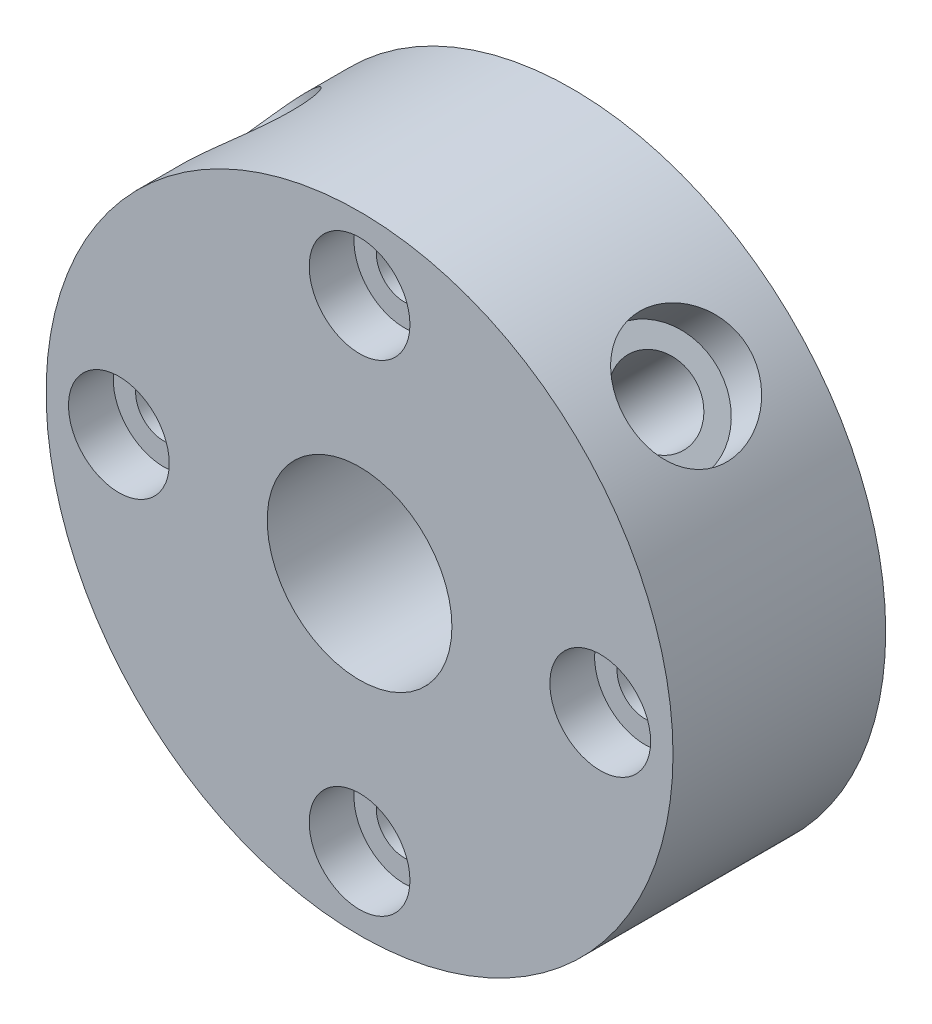
ISO-10303-21;
HEADER;
FILE_DESCRIPTION(('STEP AP214'),'2;1');
FILE_NAME('part.step','',(''),(''),'','','');
FILE_SCHEMA(('AUTOMOTIVE_DESIGN { 1 0 10303 214 1 1 1 1 }'));
ENDSEC;
DATA;
#1=APPLICATION_CONTEXT('core data for automotive mechanical design processes');
#2=APPLICATION_PROTOCOL_DEFINITION('international standard','automotive_design',2000,#1);
#3=PRODUCT_CONTEXT('',#1,'mechanical');
#4=PRODUCT('Part','Part','',(#3));
#5=PRODUCT_RELATED_PRODUCT_CATEGORY('part','',(#4));
#6=PRODUCT_DEFINITION_FORMATION('','',#4);
#7=PRODUCT_DEFINITION_CONTEXT('part definition',#1,'design');
#8=PRODUCT_DEFINITION('design','',#6,#7);
#9=PRODUCT_DEFINITION_SHAPE('','',#8);
#10=(LENGTH_UNIT() NAMED_UNIT(*) SI_UNIT(.MILLI.,.METRE.));
#11=(NAMED_UNIT(*) PLANE_ANGLE_UNIT() SI_UNIT($,.RADIAN.));
#12=(NAMED_UNIT(*) SI_UNIT($,.STERADIAN.) SOLID_ANGLE_UNIT());
#13=UNCERTAINTY_MEASURE_WITH_UNIT(LENGTH_MEASURE(1.E-05),#10,'distance_accuracy_value','');
#14=(GEOMETRIC_REPRESENTATION_CONTEXT(3) GLOBAL_UNCERTAINTY_ASSIGNED_CONTEXT((#13)) GLOBAL_UNIT_ASSIGNED_CONTEXT((#10,
#11,#12)) REPRESENTATION_CONTEXT('',''));
#15=CARTESIAN_POINT('',(0.,0.,0.));
#16=DIRECTION('',(0.,0.,1.));
#17=DIRECTION('',(1.,0.,0.));
#18=AXIS2_PLACEMENT_3D('',#15,#16,#17);
#19=CARTESIAN_POINT('',(2.12132034355965,-2.12132034355964,4.75));
#20=DIRECTION('',(-0.707106781186549,0.707106781186546,0.));
#21=DIRECTION('',(-0.707106781186546,-0.707106781186549,0.));
#22=AXIS2_PLACEMENT_3D('',#19,#20,#21);
#23=CYLINDRICAL_SURFACE('',#22,1.75);
#24=CARTESIAN_POINT('',(-3.87875519321589,1.40388145906296,4.75));
#25=CARTESIAN_POINT('',(-3.87875504872702,1.40389679740029,4.65683462411124));
#26=CARTESIAN_POINT('',(-3.87596179582414,1.41167623165675,4.56352440180328));
#27=CARTESIAN_POINT('',(-3.86467796407788,1.44226770697339,4.37960740507038));
#28=CARTESIAN_POINT('',(-3.85617217734836,1.46511987168365,4.28900852303185));
#29=CARTESIAN_POINT('',(-3.83321846153762,1.52415624225882,4.11351168243882));
#30=CARTESIAN_POINT('',(-3.81879533954179,1.56028472499894,4.02859162481189));
#31=CARTESIAN_POINT('',(-3.78359810064227,1.64379298880312,3.86597716137847));
#32=CARTESIAN_POINT('',(-3.76282532380555,1.69117039536029,3.78828123545845));
#33=CARTESIAN_POINT('',(-3.71300562380287,1.79802178820207,3.63725886737519));
#34=CARTESIAN_POINT('',(-3.68354538724624,1.85804169682687,3.56445477716569));
#35=CARTESIAN_POINT('',(-3.61636150678791,1.98563614295418,3.43010307318747));
#36=CARTESIAN_POINT('',(-3.57863462076731,2.05321363938136,3.36855989329138));
#37=CARTESIAN_POINT('',(-3.49261655032857,2.19648276506879,3.25577794831698));
#38=CARTESIAN_POINT('',(-3.44392453372875,2.27240320250071,3.20513157328556));
#39=CARTESIAN_POINT('',(-3.33714345450023,2.42649208880238,3.11960805287753));
#40=CARTESIAN_POINT('',(-3.2790587252318,2.50465948742002,3.08472366367955));
#41=CARTESIAN_POINT('',(-3.15770502236321,2.6558250919398,3.03362200270482));
#42=CARTESIAN_POINT('',(-3.09488209168043,2.72887543038908,3.01650270572978));
#43=CARTESIAN_POINT('',(-2.96314384804859,2.87137650376676,2.99849779815717));
#44=CARTESIAN_POINT('',(-2.8942311147703,2.94082874327815,2.99760534659683));
#45=CARTESIAN_POINT('',(-2.75704156560581,3.06963318358901,3.01161707315852));
#46=CARTESIAN_POINT('',(-2.68899859995951,3.12934609747977,3.0255288295855));
#47=CARTESIAN_POINT('',(-2.55171784105952,3.24226211286154,3.06704664396782));
#48=CARTESIAN_POINT('',(-2.48247995994158,3.29546473329203,3.09465371314038));
#49=CARTESIAN_POINT('',(-2.34403548506183,3.39536858978804,3.16309992813553));
#50=CARTESIAN_POINT('',(-2.27484556648633,3.4419579436046,3.20413499646392));
#51=CARTESIAN_POINT('',(-2.13986778973416,3.52746140018656,3.29807604104704));
#52=CARTESIAN_POINT('',(-2.07408115751437,3.56637275113578,3.35098625891696));
#53=CARTESIAN_POINT('',(-1.94353900932661,3.63926780944078,3.47164447097263));
#54=CARTESIAN_POINT('',(-1.8792061184678,3.67268765776492,3.54019149971046));
#55=CARTESIAN_POINT('',(-1.75966291195632,3.73144174354957,3.68793544630793));
#56=CARTESIAN_POINT('',(-1.70445638098777,3.75677263056993,3.76713675790751));
#57=CARTESIAN_POINT('',(-1.6041524191666,3.80071451501754,3.93744471039027));
#58=CARTESIAN_POINT('',(-1.55947820988091,3.81905820723174,4.02887182257843));
#59=CARTESIAN_POINT('',(-1.48578902282584,3.84833036274252,4.21893122891693));
#60=CARTESIAN_POINT('',(-1.45676237184095,3.85926435530996,4.31755808945045));
#61=CARTESIAN_POINT('',(-1.41800916493867,3.87366458989071,4.51221821762711));
#62=CARTESIAN_POINT('',(-1.40712688812988,3.87757932894082,4.60798737853588));
#63=CARTESIAN_POINT('',(-1.40189153189013,3.87947652441924,4.80001922446157));
#64=CARTESIAN_POINT('',(-1.40753237532972,3.87746116191105,4.89628171503356));
#65=CARTESIAN_POINT('',(-1.43393125947882,3.86776882129364,5.0797203713787));
#66=CARTESIAN_POINT('',(-1.4536441097922,3.86048284037411,5.16707149464675));
#67=CARTESIAN_POINT('',(-1.50571910017159,3.84046965898871,5.3372519131145));
#68=CARTESIAN_POINT('',(-1.53808426980661,3.82774115525466,5.4200801198945));
#69=CARTESIAN_POINT('',(-1.6153061610817,3.79581649336568,5.58285607332163));
#70=CARTESIAN_POINT('',(-1.66064099667774,3.776365306974,5.6625259646047));
#71=CARTESIAN_POINT('',(-1.76091101964833,3.73066351917329,5.81343952711155));
#72=CARTESIAN_POINT('',(-1.81585046628037,3.70440989865848,5.88467943637635));
#73=CARTESIAN_POINT('',(-1.93809565714854,3.64204627931806,6.0230155641412));
#74=CARTESIAN_POINT('',(-2.0060555626498,3.60528823582755,6.08924505671109));
#75=CARTESIAN_POINT('',(-2.14781782978841,3.52267331279601,6.20850400627098));
#76=CARTESIAN_POINT('',(-2.22162071645001,3.47681561504164,6.26153227527956));
#77=CARTESIAN_POINT('',(-2.3724429448231,3.37570794353618,6.35289858037206));
#78=CARTESIAN_POINT('',(-2.44947402830687,3.32042093909688,6.3911766799386));
#79=CARTESIAN_POINT('',(-2.6033082774888,3.20122693568277,6.45116037498667));
#80=CARTESIAN_POINT('',(-2.68011155492852,3.13732530519757,6.47287623610936));
#81=CARTESIAN_POINT('',(-2.82497343926154,3.00731387533357,6.49779200143486));
#82=CARTESIAN_POINT('',(-2.89326350026185,2.94169439906989,6.50221257243772));
#83=CARTESIAN_POINT('',(-3.0247776419073,2.80628690238728,6.49572107858363));
#84=CARTESIAN_POINT('',(-3.08800266705183,2.73649966340565,6.48481187940356));
#85=CARTESIAN_POINT('',(-3.20546510895128,2.59780202985199,6.44884685108928));
#86=CARTESIAN_POINT('',(-3.25995182505672,2.52895810736167,6.42434101843772));
#87=CARTESIAN_POINT('',(-3.3618585762086,2.39182709550411,6.36248977108512));
#88=CARTESIAN_POINT('',(-3.40927729259944,2.32354011228416,6.32514196478273));
#89=CARTESIAN_POINT('',(-3.49872283612633,2.18667582389566,6.23677445924827));
#90=CARTESIAN_POINT('',(-3.54040621700387,2.11822664767966,6.18521006459595));
#91=CARTESIAN_POINT('',(-3.61584225868931,1.98672253134804,6.07065392087558));
#92=CARTESIAN_POINT('',(-3.6495918376877,1.92366969341634,6.00765774802337));
#93=CARTESIAN_POINT('',(-3.71170213019758,1.8010952065894,5.86676244737382));
#94=CARTESIAN_POINT('',(-3.73951051806183,1.74214161209223,5.78812301670563));
#95=CARTESIAN_POINT('',(-3.78716235341497,1.63597850132651,5.62100112870199));
#96=CARTESIAN_POINT('',(-3.80700124127507,1.58877571396041,5.53251307348987));
#97=CARTESIAN_POINT('',(-3.83926364131782,1.50914831731297,5.348174375474));
#98=CARTESIAN_POINT('',(-3.85171050876722,1.47667724043257,5.25234801333486));
#99=CARTESIAN_POINT('',(-3.86971447524827,1.4288512859078,5.05608939168261));
#100=CARTESIAN_POINT('',(-3.87529468873944,1.41343900284144,4.95567377111812));
#101=CARTESIAN_POINT('',(-3.87836191080345,1.40496346798567,4.8199078677301));
#102=CARTESIAN_POINT('',(-3.87875524744128,1.40387570272184,4.78496413419555));
#103=CARTESIAN_POINT('',(-3.87875519321589,1.40388145906296,4.75));
#104=B_SPLINE_CURVE_WITH_KNOTS('',3,(#24,#25,#26,#27,#28,#29,#30,#31,#32,#33,#34,#35,#36,#37,
#38,#39,#40,#41,#42,#43,#44,#45,#46,#47,#48,#49,#50,#51,#52,#53,#54,#55,#56,#57,#58,#59,#60,#61,
#62,#63,#64,#65,#66,#67,#68,#69,#70,#71,#72,#73,#74,#75,#76,#77,#78,#79,#80,#81,#82,#83,#84,#85,
#86,#87,#88,#89,#90,#91,#92,#93,#94,#95,#96,#97,#98,#99,#100,#101,#102,#103),.UNSPECIFIED.,.T.,
.F.,(4,2,2,2,2,2,2,2,2,2,2,2,2,2,2,2,2,2,2,2,2,2,2,2,2,2,2,2,2,2,2,2,2,2,2,2,2,2,2,4),(0.,
0.279393045522117,0.559532854151841,0.838510049788066,1.11742840910632,1.41268093983001,
1.70804947433979,2.01678532860467,2.32537915077832,2.61739741514974,2.90929256671864,
3.18278387864067,3.45629538727546,3.73399017073292,4.01178430066578,4.30977305525939,
4.60788507689962,4.91646886951211,5.22482213621397,5.512657373983,5.80038676053791,
6.0687111120657,6.33709975264009,6.61705179220311,6.89712829558488,7.20100792212447,
7.50491488499066,7.81004405289107,8.11498394094752,8.39796631566544,8.68089579799355,
8.95313685094106,9.22542863168535,9.5101081932848,9.79489815388857,10.0998965797762,
10.4050692582123,10.7092725345641,11.0124489787529,11.1173026955307),.UNSPECIFIED.);
#105=CARTESIAN_POINT('',(-3.87875519321589,1.40388145906296,4.75));
#106=VERTEX_POINT('',#105);
#107=EDGE_CURVE('E116',#106,#106,#104,.T.);
#108=ORIENTED_EDGE('',*,*,#107,.T.);
#109=EDGE_LOOP('',(#108));
#110=FACE_BOUND('',#109,.T.);
#111=CARTESIAN_POINT('',(-8.48528137423859,8.48528137423855,4.75));
#112=DIRECTION('',(-0.707106781186549,0.707106781186546,0.));
#113=DIRECTION('',(-0.707106781186546,-0.707106781186549,0.));
#114=AXIS2_PLACEMENT_3D('',#111,#112,#113);
#115=CIRCLE('',#114,1.75);
#116=CARTESIAN_POINT('',(-9.72271824131504,7.24784450716209,4.75));
#117=VERTEX_POINT('',#116);
#118=EDGE_CURVE('E67',#117,#117,#115,.F.);
#119=ORIENTED_EDGE('',*,*,#118,.F.);
#120=EDGE_LOOP('',(#119));
#121=FACE_BOUND('',#120,.T.);
#122=ADVANCED_FACE('F37',(#110,#121),#23,.F.);
#123=CARTESIAN_POINT('',(-2.12132034355964,-2.12132034355965,4.75));
#124=DIRECTION('',(0.707106781186546,0.707106781186549,0.));
#125=DIRECTION('',(-0.707106781186549,0.707106781186546,0.));
#126=AXIS2_PLACEMENT_3D('',#123,#124,#125);
#127=CYLINDRICAL_SURFACE('',#126,1.75);
#128=CARTESIAN_POINT('',(1.40388145906297,3.87875519321589,4.75));
#129=CARTESIAN_POINT('',(1.40389679740029,3.87875504872702,4.65683462411124));
#130=CARTESIAN_POINT('',(1.41167623165676,3.87596179582414,4.56352440180328));
#131=CARTESIAN_POINT('',(1.44226770697339,3.86467796407788,4.37960740507038));
#132=CARTESIAN_POINT('',(1.46511987168365,3.85617217734836,4.28900852303185));
#133=CARTESIAN_POINT('',(1.52415624225882,3.83321846153762,4.11351168243883));
#134=CARTESIAN_POINT('',(1.56028472499894,3.81879533954179,4.0285916248119));
#135=CARTESIAN_POINT('',(1.64379298880312,3.78359810064227,3.86597716137847));
#136=CARTESIAN_POINT('',(1.69117039536029,3.76282532380555,3.78828123545845));
#137=CARTESIAN_POINT('',(1.79802178820207,3.71300562380287,3.63725886737519));
#138=CARTESIAN_POINT('',(1.85804169682687,3.68354538724624,3.56445477716569));
#139=CARTESIAN_POINT('',(1.98563614295418,3.61636150678791,3.43010307318747));
#140=CARTESIAN_POINT('',(2.05321363938136,3.57863462076731,3.36855989329138));
#141=CARTESIAN_POINT('',(2.19648276506879,3.49261655032857,3.25577794831698));
#142=CARTESIAN_POINT('',(2.27240320250071,3.44392453372875,3.20513157328556));
#143=CARTESIAN_POINT('',(2.42649208880238,3.33714345450023,3.11960805287753));
#144=CARTESIAN_POINT('',(2.50465948742001,3.2790587252318,3.08472366367955));
#145=CARTESIAN_POINT('',(2.6558250919398,3.15770502236321,3.03362200270482));
#146=CARTESIAN_POINT('',(2.72887543038907,3.09488209168043,3.01650270572978));
#147=CARTESIAN_POINT('',(2.87137650376676,2.96314384804859,2.99849779815717));
#148=CARTESIAN_POINT('',(2.94082874327815,2.89423111477031,2.99760534659683));
#149=CARTESIAN_POINT('',(3.06963318358901,2.75704156560581,3.01161707315852));
#150=CARTESIAN_POINT('',(3.12934609747977,2.68899859995951,3.0255288295855));
#151=CARTESIAN_POINT('',(3.24226211286153,2.55171784105952,3.06704664396782));
#152=CARTESIAN_POINT('',(3.29546473329203,2.48247995994158,3.09465371314038));
#153=CARTESIAN_POINT('',(3.39536858978804,2.34403548506183,3.16309992813553));
#154=CARTESIAN_POINT('',(3.4419579436046,2.27484556648633,3.20413499646392));
#155=CARTESIAN_POINT('',(3.52746140018656,2.13986778973416,3.29807604104704));
#156=CARTESIAN_POINT('',(3.56637275113578,2.07408115751437,3.35098625891696));
#157=CARTESIAN_POINT('',(3.63926780944078,1.94353900932661,3.47164447097262));
#158=CARTESIAN_POINT('',(3.67268765776492,1.8792061184678,3.54019149971046));
#159=CARTESIAN_POINT('',(3.73144174354957,1.75966291195632,3.68793544630793));
#160=CARTESIAN_POINT('',(3.75677263056993,1.70445638098778,3.76713675790751));
#161=CARTESIAN_POINT('',(3.80071451501754,1.6041524191666,3.93744471039027));
#162=CARTESIAN_POINT('',(3.81905820723174,1.55947820988091,4.02887182257843));
#163=CARTESIAN_POINT('',(3.84833036274252,1.48578902282584,4.21893122891693));
#164=CARTESIAN_POINT('',(3.85926435530996,1.45676237184095,4.31755808945045));
#165=CARTESIAN_POINT('',(3.87366458989071,1.41800916493868,4.51221821762711));
#166=CARTESIAN_POINT('',(3.87757932894082,1.40712688812988,4.60798737853588));
#167=CARTESIAN_POINT('',(3.87947652441924,1.40189153189012,4.80001922446157));
#168=CARTESIAN_POINT('',(3.87746116191105,1.40753237532972,4.89628171503356));
#169=CARTESIAN_POINT('',(3.86776882129364,1.43393125947882,5.0797203713787));
#170=CARTESIAN_POINT('',(3.86048284037411,1.4536441097922,5.16707149464675));
#171=CARTESIAN_POINT('',(3.84046965898871,1.50571910017159,5.3372519131145));
#172=CARTESIAN_POINT('',(3.82774115525466,1.5380842698066,5.42008011989449));
#173=CARTESIAN_POINT('',(3.79581649336568,1.6153061610817,5.58285607332163));
#174=CARTESIAN_POINT('',(3.776365306974,1.66064099667774,5.6625259646047));
#175=CARTESIAN_POINT('',(3.73066351917329,1.76091101964833,5.81343952711154));
#176=CARTESIAN_POINT('',(3.70440989865848,1.81585046628037,5.88467943637635));
#177=CARTESIAN_POINT('',(3.64204627931806,1.93809565714854,6.0230155641412));
#178=CARTESIAN_POINT('',(3.60528823582755,2.00605556264979,6.08924505671109));
#179=CARTESIAN_POINT('',(3.52267331279601,2.14781782978841,6.20850400627097));
#180=CARTESIAN_POINT('',(3.47681561504165,2.22162071645001,6.26153227527956));
#181=CARTESIAN_POINT('',(3.37570794353618,2.3724429448231,6.35289858037206));
#182=CARTESIAN_POINT('',(3.32042093909688,2.44947402830687,6.3911766799386));
#183=CARTESIAN_POINT('',(3.20122693568277,2.6033082774888,6.45116037498667));
#184=CARTESIAN_POINT('',(3.13732530519757,2.68011155492852,6.47287623610936));
#185=CARTESIAN_POINT('',(3.00731387533357,2.82497343926154,6.49779200143486));
#186=CARTESIAN_POINT('',(2.94169439906989,2.89326350026185,6.50221257243772));
#187=CARTESIAN_POINT('',(2.80628690238728,3.0247776419073,6.49572107858363));
#188=CARTESIAN_POINT('',(2.73649966340565,3.08800266705183,6.48481187940356));
#189=CARTESIAN_POINT('',(2.59780202985199,3.20546510895128,6.44884685108928));
#190=CARTESIAN_POINT('',(2.52895810736167,3.25995182505672,6.42434101843772));
#191=CARTESIAN_POINT('',(2.39182709550411,3.3618585762086,6.36248977108512));
#192=CARTESIAN_POINT('',(2.32354011228416,3.40927729259944,6.32514196478273));
#193=CARTESIAN_POINT('',(2.18667582389566,3.49872283612633,6.23677445924827));
#194=CARTESIAN_POINT('',(2.11822664767966,3.54040621700387,6.18521006459595));
#195=CARTESIAN_POINT('',(1.98672253134804,3.61584225868931,6.07065392087558));
#196=CARTESIAN_POINT('',(1.92366969341634,3.64959183768769,6.00765774802337));
#197=CARTESIAN_POINT('',(1.8010952065894,3.71170213019758,5.86676244737382));
#198=CARTESIAN_POINT('',(1.74214161209223,3.73951051806183,5.78812301670563));
#199=CARTESIAN_POINT('',(1.63597850132652,3.78716235341497,5.62100112870199));
#200=CARTESIAN_POINT('',(1.58877571396041,3.80700124127507,5.53251307348987));
#201=CARTESIAN_POINT('',(1.50914831731297,3.83926364131782,5.348174375474));
#202=CARTESIAN_POINT('',(1.47667724043257,3.85171050876722,5.25234801333486));
#203=CARTESIAN_POINT('',(1.4288512859078,3.86971447524826,5.05608939168261));
#204=CARTESIAN_POINT('',(1.41343900284144,3.87529468873944,4.95567377111812));
#205=CARTESIAN_POINT('',(1.40496346798567,3.87836191080345,4.8199078677301));
#206=CARTESIAN_POINT('',(1.40387570272184,3.87875524744128,4.78496413419555));
#207=CARTESIAN_POINT('',(1.40388145906297,3.87875519321589,4.75));
#208=B_SPLINE_CURVE_WITH_KNOTS('',3,(#128,#129,#130,#131,#132,#133,#134,#135,#136,#137,#138,
#139,#140,#141,#142,#143,#144,#145,#146,#147,#148,#149,#150,#151,#152,#153,#154,#155,#156,#157,
#158,#159,#160,#161,#162,#163,#164,#165,#166,#167,#168,#169,#170,#171,#172,#173,#174,#175,#176,
#177,#178,#179,#180,#181,#182,#183,#184,#185,#186,#187,#188,#189,#190,#191,#192,#193,#194,#195,
#196,#197,#198,#199,#200,#201,#202,#203,#204,#205,#206,#207),.UNSPECIFIED.,.T.,.F.,(4,2,2,2,2,2,
2,2,2,2,2,2,2,2,2,2,2,2,2,2,2,2,2,2,2,2,2,2,2,2,2,2,2,2,2,2,2,2,2,4),(0.,0.279393045522116,
0.559532854151839,0.838510049788063,1.11742840910631,1.41268093983001,1.70804947433979,
2.01678532860466,2.32537915077832,2.61739741514974,2.90929256671864,3.18278387864067,
3.45629538727546,3.73399017073292,4.01178430066578,4.30977305525938,4.60788507689962,
4.91646886951211,5.22482213621396,5.512657373983,5.80038676053791,6.06871111206569,
6.33709975264009,6.61705179220311,6.89712829558488,7.20100792212446,7.50491488499066,
7.81004405289107,8.11498394094752,8.39796631566544,8.68089579799354,8.95313685094106,
9.22542863168535,9.5101081932848,9.79489815388856,10.0998965797762,10.4050692582123,
10.7092725345641,11.0124489787529,11.1173026955307),.UNSPECIFIED.);
#209=CARTESIAN_POINT('',(1.40388145906297,3.87875519321589,4.75));
#210=VERTEX_POINT('',#209);
#211=EDGE_CURVE('E124',#210,#210,#208,.T.);
#212=ORIENTED_EDGE('',*,*,#211,.T.);
#213=EDGE_LOOP('',(#212));
#214=FACE_BOUND('',#213,.T.);
#215=CARTESIAN_POINT('',(8.48528137423855,8.48528137423859,4.75));
#216=DIRECTION('',(0.707106781186546,0.707106781186549,0.));
#217=DIRECTION('',(-0.707106781186549,0.707106781186546,0.));
#218=AXIS2_PLACEMENT_3D('',#215,#216,#217);
#219=CIRCLE('',#218,1.75);
#220=CARTESIAN_POINT('',(7.24784450716209,9.72271824131504,4.75));
#221=VERTEX_POINT('',#220);
#222=EDGE_CURVE('E65',#221,#221,#219,.F.);
#223=ORIENTED_EDGE('',*,*,#222,.F.);
#224=EDGE_LOOP('',(#223));
#225=FACE_BOUND('',#224,.T.);
#226=ADVANCED_FACE('F111',(#214,#225),#127,.F.);
#227=CARTESIAN_POINT('',(-10.75,0.,0.));
#228=DIRECTION('',(0.,0.,1.));
#229=DIRECTION('',(1.,0.,0.));
#230=AXIS2_PLACEMENT_3D('',#227,#228,#229);
#231=CYLINDRICAL_SURFACE('',#230,1.25);
#232=CARTESIAN_POINT('',(-10.75,0.,0.));
#233=DIRECTION('',(0.,0.,1.));
#234=DIRECTION('',(1.,0.,0.));
#235=AXIS2_PLACEMENT_3D('',#232,#233,#234);
#236=CIRCLE('',#235,1.25);
#237=CARTESIAN_POINT('',(-9.5,0.,0.));
#238=VERTEX_POINT('',#237);
#239=EDGE_CURVE('E166',#238,#238,#236,.T.);
#240=ORIENTED_EDGE('',*,*,#239,.F.);
#241=EDGE_LOOP('',(#240));
#242=FACE_BOUND('',#241,.T.);
#243=CARTESIAN_POINT('',(-10.75,0.,7.5));
#244=DIRECTION('',(0.,0.,1.));
#245=DIRECTION('',(1.,0.,0.));
#246=AXIS2_PLACEMENT_3D('',#243,#244,#245);
#247=CIRCLE('',#246,1.25);
#248=CARTESIAN_POINT('',(-9.5,0.,7.5));
#249=VERTEX_POINT('',#248);
#250=EDGE_CURVE('E125',#249,#249,#247,.F.);
#251=ORIENTED_EDGE('',*,*,#250,.F.);
#252=EDGE_LOOP('',(#251));
#253=FACE_BOUND('',#252,.T.);
#254=ADVANCED_FACE('F253',(#242,#253),#231,.F.);
#255=CARTESIAN_POINT('',(0.,-10.75,0.));
#256=DIRECTION('',(0.,0.,1.));
#257=DIRECTION('',(1.,0.,0.));
#258=AXIS2_PLACEMENT_3D('',#255,#256,#257);
#259=CYLINDRICAL_SURFACE('',#258,1.25);
#260=CARTESIAN_POINT('',(0.,-10.75,0.));
#261=DIRECTION('',(0.,0.,1.));
#262=DIRECTION('',(1.,0.,0.));
#263=AXIS2_PLACEMENT_3D('',#260,#261,#262);
#264=CIRCLE('',#263,1.25);
#265=CARTESIAN_POINT('',(1.25,-10.75,0.));
#266=VERTEX_POINT('',#265);
#267=EDGE_CURVE('E162',#266,#266,#264,.T.);
#268=ORIENTED_EDGE('',*,*,#267,.F.);
#269=EDGE_LOOP('',(#268));
#270=FACE_BOUND('',#269,.T.);
#271=CARTESIAN_POINT('',(0.,-10.75,7.5));
#272=DIRECTION('',(0.,0.,1.));
#273=DIRECTION('',(1.,0.,0.));
#274=AXIS2_PLACEMENT_3D('',#271,#272,#273);
#275=CIRCLE('',#274,1.25);
#276=CARTESIAN_POINT('',(1.25,-10.75,7.5));
#277=VERTEX_POINT('',#276);
#278=EDGE_CURVE('E468',#277,#277,#275,.F.);
#279=ORIENTED_EDGE('',*,*,#278,.F.);
#280=EDGE_LOOP('',(#279));
#281=FACE_BOUND('',#280,.T.);
#282=ADVANCED_FACE('F258',(#270,#281),#259,.F.);
#283=CARTESIAN_POINT('',(10.75,0.,0.));
#284=DIRECTION('',(0.,0.,1.));
#285=DIRECTION('',(1.,0.,0.));
#286=AXIS2_PLACEMENT_3D('',#283,#284,#285);
#287=CYLINDRICAL_SURFACE('',#286,1.25);
#288=CARTESIAN_POINT('',(10.75,0.,0.));
#289=DIRECTION('',(0.,0.,1.));
#290=DIRECTION('',(1.,0.,0.));
#291=AXIS2_PLACEMENT_3D('',#288,#289,#290);
#292=CIRCLE('',#291,1.25);
#293=CARTESIAN_POINT('',(12.,0.,0.));
#294=VERTEX_POINT('',#293);
#295=EDGE_CURVE('E158',#294,#294,#292,.T.);
#296=ORIENTED_EDGE('',*,*,#295,.F.);
#297=EDGE_LOOP('',(#296));
#298=FACE_BOUND('',#297,.T.);
#299=CARTESIAN_POINT('',(10.75,0.,7.5));
#300=DIRECTION('',(0.,0.,1.));
#301=DIRECTION('',(1.,0.,0.));
#302=AXIS2_PLACEMENT_3D('',#299,#300,#301);
#303=CIRCLE('',#302,1.25);
#304=CARTESIAN_POINT('',(12.,0.,7.5));
#305=VERTEX_POINT('',#304);
#306=EDGE_CURVE('E466',#305,#305,#303,.F.);
#307=ORIENTED_EDGE('',*,*,#306,.F.);
#308=EDGE_LOOP('',(#307));
#309=FACE_BOUND('',#308,.T.);
#310=ADVANCED_FACE('F270',(#298,#309),#287,.F.);
#311=CARTESIAN_POINT('',(0.,10.75,0.));
#312=DIRECTION('',(0.,0.,1.));
#313=DIRECTION('',(1.,0.,0.));
#314=AXIS2_PLACEMENT_3D('',#311,#312,#313);
#315=CYLINDRICAL_SURFACE('',#314,1.25);
#316=CARTESIAN_POINT('',(0.,10.75,0.));
#317=DIRECTION('',(0.,0.,1.));
#318=DIRECTION('',(1.,0.,0.));
#319=AXIS2_PLACEMENT_3D('',#316,#317,#318);
#320=CIRCLE('',#319,1.25);
#321=CARTESIAN_POINT('',(1.25,10.75,0.));
#322=VERTEX_POINT('',#321);
#323=EDGE_CURVE('E154',#322,#322,#320,.T.);
#324=ORIENTED_EDGE('',*,*,#323,.F.);
#325=EDGE_LOOP('',(#324));
#326=FACE_BOUND('',#325,.T.);
#327=CARTESIAN_POINT('',(0.,10.75,7.5));
#328=DIRECTION('',(0.,0.,1.));
#329=DIRECTION('',(1.,0.,0.));
#330=AXIS2_PLACEMENT_3D('',#327,#328,#329);
#331=CIRCLE('',#330,1.25);
#332=CARTESIAN_POINT('',(1.25,10.75,7.5));
#333=VERTEX_POINT('',#332);
#334=EDGE_CURVE('E130',#333,#333,#331,.F.);
#335=ORIENTED_EDGE('',*,*,#334,.F.);
#336=EDGE_LOOP('',(#335));
#337=FACE_BOUND('',#336,.T.);
#338=ADVANCED_FACE('F150',(#326,#337),#315,.F.);
#339=CARTESIAN_POINT('',(0.,0.,2.));
#340=DIRECTION('',(0.,0.,-1.));
#341=DIRECTION('',(-1.,0.,0.));
#342=AXIS2_PLACEMENT_3D('',#339,#340,#341);
#343=CYLINDRICAL_SURFACE('',#342,14.);
#344=CARTESIAN_POINT('',(-11.6511779774216,7.76209068089556,4.75));
#345=CARTESIAN_POINT('',(-11.6511760710743,7.76209685743818,4.59713864487768));
#346=CARTESIAN_POINT('',(-11.6439600918152,7.77295873329219,4.44420467965564));
#347=CARTESIAN_POINT('',(-11.6151562478213,7.81593176789737,4.14265905280335));
#348=CARTESIAN_POINT('',(-11.5935566814567,7.84806022774672,3.99405101331165));
#349=CARTESIAN_POINT('',(-11.5362296800744,7.9320849840361,3.70556360702522));
#350=CARTESIAN_POINT('',(-11.5005160354634,7.9839619830083,3.5656758739027));
#351=CARTESIAN_POINT('',(-11.4153350658881,8.10528188694974,3.29828223466166));
#352=CARTESIAN_POINT('',(-11.3658685973735,8.17472369805544,3.1707755581864));
#353=CARTESIAN_POINT('',(-11.2530317647504,8.32937722105698,2.9300161059738));
#354=CARTESIAN_POINT('',(-11.1894986642951,8.4147715125977,2.81695685091667));
#355=CARTESIAN_POINT('',(-11.0496963781696,8.59752415467707,2.60999006066215));
#356=CARTESIAN_POINT('',(-10.9734263172008,8.69488332733456,2.51608384266932));
#357=CARTESIAN_POINT('',(-10.8086291445262,8.89892412332568,2.34934056719733));
#358=CARTESIAN_POINT('',(-10.7200045154781,9.00567714337162,2.27668699234182));
#359=CARTESIAN_POINT('',(-10.5327025177477,9.22403606803345,2.15569481193111));
#360=CARTESIAN_POINT('',(-10.4340260574771,9.33564153359888,2.10735401150367));
#361=CARTESIAN_POINT('',(-10.2302260166266,9.55850280250496,2.03696085636299));
#362=CARTESIAN_POINT('',(-10.125200430248,9.66974499008799,2.01458187495326));
#363=CARTESIAN_POINT('',(-9.91038456070153,9.88978808390079,1.99572894559391));
#364=CARTESIAN_POINT('',(-9.80059472202804,9.99858921644498,1.99925258612951));
#365=CARTESIAN_POINT('',(-9.58102744775139,10.2091500460516,2.0318563354567));
#366=CARTESIAN_POINT('',(-9.4712705661895,10.3109859487607,2.06058465450608));
#367=CARTESIAN_POINT('',(-9.25368197503286,10.5067024995948,2.14222474936271));
#368=CARTESIAN_POINT('',(-9.14585034068459,10.6005828373187,2.19513746825414));
#369=CARTESIAN_POINT('',(-8.93496579021392,10.7789421572765,2.32397297266082));
#370=CARTESIAN_POINT('',(-8.83194610420595,10.8633601811193,2.40003439842101));
#371=CARTESIAN_POINT('',(-8.6348846554936,11.0206482091051,2.57290575092377));
#372=CARTESIAN_POINT('',(-8.54084389264235,11.0935169277635,2.66971798449848));
#373=CARTESIAN_POINT('',(-8.36359389448011,11.2277730733744,2.88327523820785));
#374=CARTESIAN_POINT('',(-8.28059342328153,11.2889467968924,3.00032810568758));
#375=CARTESIAN_POINT('',(-8.13053710814367,11.3974983784731,3.25002375031689));
#376=CARTESIAN_POINT('',(-8.06348154485832,11.4448759937072,3.38266680181535));
#377=CARTESIAN_POINT('',(-7.9479795776025,11.5253898480945,3.66019695454488));
#378=CARTESIAN_POINT('',(-7.89957076518362,11.5584973347093,3.80510807845731));
#379=CARTESIAN_POINT('',(-7.82372493303534,11.6099720242653,4.10281950411176));
#380=CARTESIAN_POINT('',(-7.79628528514657,11.6283410744552,4.25561881462842));
#381=CARTESIAN_POINT('',(-7.76393296601738,11.6499665945253,4.56206569919598));
#382=CARTESIAN_POINT('',(-7.75865572008286,11.6534676558465,4.71565758188245));
#383=CARTESIAN_POINT('',(-7.76987377383254,11.6459909608475,5.02168243713359));
#384=CARTESIAN_POINT('',(-7.78636788530818,11.6350139946901,5.17411547248767));
#385=CARTESIAN_POINT('',(-7.84010957468696,11.5988664947171,5.47205705658004));
#386=CARTESIAN_POINT('',(-7.87716491147389,11.5738274114488,5.61761639167118));
#387=CARTESIAN_POINT('',(-7.97027158902165,11.5099061771373,5.89931251813332));
#388=CARTESIAN_POINT('',(-8.02632444711121,11.4710229203497,6.03544855582098));
#389=CARTESIAN_POINT('',(-8.15593958330598,11.3792359676262,6.29632225600289));
#390=CARTESIAN_POINT('',(-8.229713598075,11.3261617735527,6.42089467042176));
#391=CARTESIAN_POINT('',(-8.39149189120414,11.2068257799823,6.65337678166906));
#392=CARTESIAN_POINT('',(-8.47949757981278,11.1405626734163,6.76128482511373));
#393=CARTESIAN_POINT('',(-8.66788418245452,10.9946423388,6.95900125477127));
#394=CARTESIAN_POINT('',(-8.76842864337674,10.9148017777596,7.04851884805999));
#395=CARTESIAN_POINT('',(-8.97720229742934,10.7437434762889,7.20485372190564));
#396=CARTESIAN_POINT('',(-9.085431175118,10.6525262027513,7.27167193361096));
#397=CARTESIAN_POINT('',(-9.30519361072117,10.4610931191872,7.38028411926557));
#398=CARTESIAN_POINT('',(-9.41670517858037,10.3609307606668,7.42221661584114));
#399=CARTESIAN_POINT('',(-9.63990993584737,10.1535865474959,7.48030692396769));
#400=CARTESIAN_POINT('',(-9.75160310268626,10.0464055084653,7.49646772485652));
#401=CARTESIAN_POINT('',(-9.96983508695565,9.82983362934317,7.50244353036993));
#402=CARTESIAN_POINT('',(-10.0764289582517,9.72051010286402,7.49269630858576));
#403=CARTESIAN_POINT('',(-10.2834877072507,9.50119100225686,7.44809707740773));
#404=CARTESIAN_POINT('',(-10.3839526564767,9.39119543598788,7.41324536103783));
#405=CARTESIAN_POINT('',(-10.5761187560898,9.17424036262302,7.31961812143022));
#406=CARTESIAN_POINT('',(-10.6678380278224,9.06727491541163,7.26089345488584));
#407=CARTESIAN_POINT('',(-10.8409023167005,8.85963471236125,7.12124177050664));
#408=CARTESIAN_POINT('',(-10.9222465491039,8.75896043266396,7.04031307467129));
#409=CARTESIAN_POINT('',(-11.0743849957406,8.56582542357789,6.85706506634693));
#410=CARTESIAN_POINT('',(-11.1449947627056,8.47351738730983,6.75443165263271));
#411=CARTESIAN_POINT('',(-11.2731371218947,8.30227954812329,6.53133486969797));
#412=CARTESIAN_POINT('',(-11.3306666202923,8.2233529113769,6.41086729333251));
#413=CARTESIAN_POINT('',(-11.4324685887437,8.08123775287278,6.15403136397606));
#414=CARTESIAN_POINT('',(-11.476598111931,8.0182200631203,6.01751173827291));
#415=CARTESIAN_POINT('',(-11.550271244279,7.91172932739614,5.73345773398099));
#416=CARTESIAN_POINT('',(-11.5798282437361,7.86823834216193,5.58593361120005));
#417=CARTESIAN_POINT('',(-11.6183350585297,7.81121771647316,5.32337110652133));
#418=CARTESIAN_POINT('',(-11.6306426848372,7.79284092765964,5.20984220063522));
#419=CARTESIAN_POINT('',(-11.6470647322009,7.76827527357894,4.98088929870786));
#420=CARTESIAN_POINT('',(-11.6511794174002,7.7620860153819,4.86546536388394));
#421=CARTESIAN_POINT('',(-11.6511779774216,7.76209068089556,4.75));
#422=B_SPLINE_CURVE_WITH_KNOTS('',3,(#344,#345,#346,#347,#348,#349,#350,#351,#352,#353,#354,
#355,#356,#357,#358,#359,#360,#361,#362,#363,#364,#365,#366,#367,#368,#369,#370,#371,#372,#373,
#374,#375,#376,#377,#378,#379,#380,#381,#382,#383,#384,#385,#386,#387,#388,#389,#390,#391,#392,
#393,#394,#395,#396,#397,#398,#399,#400,#401,#402,#403,#404,#405,#406,#407,#408,#409,#410,#411,
#412,#413,#414,#415,#416,#417,#418,#419,#420,#421),.UNSPECIFIED.,.T.,.F.,(4,2,2,2,2,2,2,2,2,2,2,
2,2,2,2,2,2,2,2,2,2,2,2,2,2,2,2,2,2,2,2,2,2,2,2,2,2,2,4),(0.,0.458161359266159,
0.916695907427622,1.37478353967289,1.83284265114413,2.29650709300992,2.76020341155038,
3.22779223307661,3.69533883473926,4.15693714034927,4.61849247204569,5.07370641763774,
5.52893811606669,5.98695177036365,6.44501636769502,6.91078471215003,7.37656125420932,
7.84327194031395,8.30992412187866,8.76886898779822,9.22778880706281,9.68248845652962,
10.1372244313406,10.5976905575203,11.0582023403144,11.5255141630079,11.9928068138484,
12.4574733411489,12.9220859664357,13.3788980434201,13.8357047885022,14.291543452743,
14.7474165750679,15.2104037928827,15.6735004056529,16.141376409648,16.6088216900946,
16.9549096446048,17.3009864409468),.UNSPECIFIED.);
#423=CARTESIAN_POINT('',(-11.6511779774216,7.76209068089556,4.75));
#424=VERTEX_POINT('',#423);
#425=EDGE_CURVE('E10',#424,#424,#422,.T.);
#426=ORIENTED_EDGE('',*,*,#425,.T.);
#427=EDGE_LOOP('',(#426));
#428=FACE_BOUND('',#427,.T.);
#429=CARTESIAN_POINT('',(7.76209068089556,11.6511779774216,4.75));
#430=CARTESIAN_POINT('',(7.76209685743817,11.6511760710743,4.59713864487768));
#431=CARTESIAN_POINT('',(7.77295873329218,11.6439600918152,4.44420467965564));
#432=CARTESIAN_POINT('',(7.81593176789736,11.6151562478213,4.14265905280335));
#433=CARTESIAN_POINT('',(7.84806022774672,11.5935566814567,3.99405101331165));
#434=CARTESIAN_POINT('',(7.9320849840361,11.5362296800744,3.70556360702522));
#435=CARTESIAN_POINT('',(7.9839619830083,11.5005160354634,3.5656758739027));
#436=CARTESIAN_POINT('',(8.10528188694973,11.4153350658881,3.29828223466166));
#437=CARTESIAN_POINT('',(8.17472369805544,11.3658685973735,3.1707755581864));
#438=CARTESIAN_POINT('',(8.32937722105697,11.2530317647504,2.9300161059738));
#439=CARTESIAN_POINT('',(8.41477151259769,11.1894986642951,2.81695685091667));
#440=CARTESIAN_POINT('',(8.59752415467706,11.0496963781696,2.60999006066215));
#441=CARTESIAN_POINT('',(8.69488332733455,10.9734263172008,2.51608384266932));
#442=CARTESIAN_POINT('',(8.89892412332567,10.8086291445262,2.34934056719733));
#443=CARTESIAN_POINT('',(9.00567714337162,10.7200045154781,2.27668699234182));
#444=CARTESIAN_POINT('',(9.22403606803344,10.5327025177477,2.15569481193111));
#445=CARTESIAN_POINT('',(9.33564153359888,10.4340260574771,2.10735401150367));
#446=CARTESIAN_POINT('',(9.55850280250495,10.2302260166266,2.03696085636299));
#447=CARTESIAN_POINT('',(9.66974499008799,10.125200430248,2.01458187495326));
#448=CARTESIAN_POINT('',(9.88978808390079,9.91038456070153,1.99572894559391));
#449=CARTESIAN_POINT('',(9.99858921644497,9.80059472202805,1.99925258612951));
#450=CARTESIAN_POINT('',(10.2091500460516,9.58102744775139,2.0318563354567));
#451=CARTESIAN_POINT('',(10.3109859487607,9.47127056618951,2.06058465450608));
#452=CARTESIAN_POINT('',(10.5067024995948,9.25368197503287,2.14222474936271));
#453=CARTESIAN_POINT('',(10.6005828373187,9.14585034068459,2.19513746825414));
#454=CARTESIAN_POINT('',(10.7789421572765,8.93496579021392,2.32397297266082));
#455=CARTESIAN_POINT('',(10.8633601811193,8.83194610420596,2.40003439842101));
#456=CARTESIAN_POINT('',(11.0206482091051,8.6348846554936,2.57290575092377));
#457=CARTESIAN_POINT('',(11.0935169277635,8.54084389264235,2.66971798449848));
#458=CARTESIAN_POINT('',(11.2277730733744,8.36359389448011,2.88327523820785));
#459=CARTESIAN_POINT('',(11.2889467968924,8.28059342328154,3.00032810568758));
#460=CARTESIAN_POINT('',(11.3974983784731,8.13053710814367,3.25002375031689));
#461=CARTESIAN_POINT('',(11.4448759937072,8.06348154485833,3.38266680181535));
#462=CARTESIAN_POINT('',(11.5253898480945,7.9479795776025,3.66019695454488));
#463=CARTESIAN_POINT('',(11.5584973347093,7.89957076518363,3.80510807845731));
#464=CARTESIAN_POINT('',(11.6099720242653,7.82372493303534,4.10281950411176));
#465=CARTESIAN_POINT('',(11.6283410744552,7.79628528514657,4.25561881462842));
#466=CARTESIAN_POINT('',(11.6499665945253,7.76393296601739,4.56206569919598));
#467=CARTESIAN_POINT('',(11.6534676558465,7.75865572008286,4.71565758188245));
#468=CARTESIAN_POINT('',(11.6459909608475,7.76987377383254,5.02168243713358));
#469=CARTESIAN_POINT('',(11.6350139946901,7.78636788530818,5.17411547248767));
#470=CARTESIAN_POINT('',(11.5988664947171,7.84010957468696,5.47205705658004));
#471=CARTESIAN_POINT('',(11.5738274114488,7.87716491147389,5.61761639167118));
#472=CARTESIAN_POINT('',(11.5099061771373,7.97027158902165,5.89931251813332));
#473=CARTESIAN_POINT('',(11.4710229203497,8.02632444711121,6.03544855582098));
#474=CARTESIAN_POINT('',(11.3792359676262,8.15593958330598,6.29632225600289));
#475=CARTESIAN_POINT('',(11.3261617735526,8.229713598075,6.42089467042176));
#476=CARTESIAN_POINT('',(11.2068257799823,8.39149189120414,6.65337678166906));
#477=CARTESIAN_POINT('',(11.1405626734163,8.47949757981278,6.76128482511373));
#478=CARTESIAN_POINT('',(10.9946423388,8.66788418245452,6.95900125477127));
#479=CARTESIAN_POINT('',(10.9148017777596,8.76842864337674,7.04851884805999));
#480=CARTESIAN_POINT('',(10.7437434762889,8.97720229742934,7.20485372190564));
#481=CARTESIAN_POINT('',(10.6525262027513,9.085431175118,7.27167193361096));
#482=CARTESIAN_POINT('',(10.4610931191872,9.30519361072118,7.38028411926557));
#483=CARTESIAN_POINT('',(10.3609307606668,9.41670517858037,7.42221661584114));
#484=CARTESIAN_POINT('',(10.1535865474959,9.63990993584737,7.48030692396769));
#485=CARTESIAN_POINT('',(10.0464055084653,9.75160310268626,7.49646772485652));
#486=CARTESIAN_POINT('',(9.82983362934317,9.96983508695565,7.50244353036993));
#487=CARTESIAN_POINT('',(9.72051010286401,10.0764289582517,7.49269630858576));
#488=CARTESIAN_POINT('',(9.50119100225685,10.2834877072507,7.44809707740773));
#489=CARTESIAN_POINT('',(9.39119543598788,10.3839526564767,7.41324536103783));
#490=CARTESIAN_POINT('',(9.17424036262301,10.5761187560898,7.31961812143023));
#491=CARTESIAN_POINT('',(9.06727491541162,10.6678380278224,7.26089345488584));
#492=CARTESIAN_POINT('',(8.85963471236125,10.8409023167005,7.12124177050664));
#493=CARTESIAN_POINT('',(8.75896043266396,10.9222465491039,7.04031307467129));
#494=CARTESIAN_POINT('',(8.56582542357789,11.0743849957406,6.85706506634693));
#495=CARTESIAN_POINT('',(8.47351738730982,11.1449947627056,6.75443165263271));
#496=CARTESIAN_POINT('',(8.30227954812328,11.2731371218947,6.53133486969797));
#497=CARTESIAN_POINT('',(8.2233529113769,11.3306666202923,6.41086729333251));
#498=CARTESIAN_POINT('',(8.08123775287278,11.4324685887437,6.15403136397606));
#499=CARTESIAN_POINT('',(8.01822006312029,11.476598111931,6.01751173827291));
#500=CARTESIAN_POINT('',(7.91172932739613,11.550271244279,5.73345773398099));
#501=CARTESIAN_POINT('',(7.86823834216192,11.5798282437361,5.58593361120005));
#502=CARTESIAN_POINT('',(7.81121771647315,11.6183350585297,5.32337110652133));
#503=CARTESIAN_POINT('',(7.79284092765964,11.6306426848372,5.20984220063522));
#504=CARTESIAN_POINT('',(7.76827527357894,11.6470647322009,4.98088929870786));
#505=CARTESIAN_POINT('',(7.76208601538189,11.6511794174002,4.86546536388394));
#506=CARTESIAN_POINT('',(7.76209068089556,11.6511779774216,4.75));
#507=B_SPLINE_CURVE_WITH_KNOTS('',3,(#429,#430,#431,#432,#433,#434,#435,#436,#437,#438,#439,
#440,#441,#442,#443,#444,#445,#446,#447,#448,#449,#450,#451,#452,#453,#454,#455,#456,#457,#458,
#459,#460,#461,#462,#463,#464,#465,#466,#467,#468,#469,#470,#471,#472,#473,#474,#475,#476,#477,
#478,#479,#480,#481,#482,#483,#484,#485,#486,#487,#488,#489,#490,#491,#492,#493,#494,#495,#496,
#497,#498,#499,#500,#501,#502,#503,#504,#505,#506),.UNSPECIFIED.,.T.,.F.,(4,2,2,2,2,2,2,2,2,2,2,
2,2,2,2,2,2,2,2,2,2,2,2,2,2,2,2,2,2,2,2,2,2,2,2,2,2,2,4),(0.,0.458161359266159,
0.916695907427622,1.37478353967289,1.83284265114413,2.29650709300992,2.76020341155038,
3.22779223307661,3.69533883473926,4.15693714034927,4.61849247204569,5.07370641763774,
5.52893811606669,5.98695177036365,6.44501636769502,6.91078471215002,7.37656125420932,
7.84327194031394,8.30992412187866,8.76886898779822,9.22778880706281,9.68248845652962,
10.1372244313406,10.5976905575203,11.0582023403144,11.5255141630079,11.9928068138484,
12.4574733411489,12.9220859664357,13.3788980434201,13.8357047885022,14.291543452743,
14.7474165750679,15.2104037928827,15.6735004056529,16.141376409648,16.6088216900946,
16.9549096446048,17.3009864409468),.UNSPECIFIED.);
#508=CARTESIAN_POINT('',(7.76209068089556,11.6511779774216,4.75));
#509=VERTEX_POINT('',#508);
#510=EDGE_CURVE('E49',#509,#509,#507,.T.);
#511=ORIENTED_EDGE('',*,*,#510,.T.);
#512=EDGE_LOOP('',(#511));
#513=FACE_BOUND('',#512,.T.);
#514=CARTESIAN_POINT('',(0.,0.,0.));
#515=DIRECTION('',(0.,0.,1.));
#516=DIRECTION('',(1.,0.,0.));
#517=AXIS2_PLACEMENT_3D('',#514,#515,#516);
#518=CIRCLE('',#517,14.);
#519=CARTESIAN_POINT('',(14.,0.,0.));
#520=VERTEX_POINT('',#519);
#521=EDGE_CURVE('E53',#520,#520,#518,.T.);
#522=ORIENTED_EDGE('',*,*,#521,.T.);
#523=EDGE_LOOP('',(#522));
#524=FACE_BOUND('',#523,.T.);
#525=CARTESIAN_POINT('',(0.,0.,9.5));
#526=DIRECTION('',(0.,0.,1.));
#527=DIRECTION('',(1.,0.,0.));
#528=AXIS2_PLACEMENT_3D('',#525,#526,#527);
#529=CIRCLE('',#528,14.);
#530=CARTESIAN_POINT('',(14.,0.,9.5));
#531=VERTEX_POINT('',#530);
#532=EDGE_CURVE('E58',#531,#531,#529,.T.);
#533=ORIENTED_EDGE('',*,*,#532,.F.);
#534=EDGE_LOOP('',(#533));
#535=FACE_BOUND('',#534,.T.);
#536=ADVANCED_FACE('F39',(#428,#513,#524,#535),#343,.T.);
#537=CARTESIAN_POINT('',(0.,0.,0.));
#538=DIRECTION('',(0.,0.,1.));
#539=DIRECTION('',(1.,0.,0.));
#540=AXIS2_PLACEMENT_3D('',#537,#538,#539);
#541=PLANE('',#540);
#542=ORIENTED_EDGE('',*,*,#323,.T.);
#543=EDGE_LOOP('',(#542));
#544=FACE_BOUND('',#543,.T.);
#545=ORIENTED_EDGE('',*,*,#295,.T.);
#546=EDGE_LOOP('',(#545));
#547=FACE_BOUND('',#546,.T.);
#548=ORIENTED_EDGE('',*,*,#267,.T.);
#549=EDGE_LOOP('',(#548));
#550=FACE_BOUND('',#549,.T.);
#551=ORIENTED_EDGE('',*,*,#239,.T.);
#552=EDGE_LOOP('',(#551));
#553=FACE_BOUND('',#552,.T.);
#554=CARTESIAN_POINT('',(0.,0.,0.));
#555=DIRECTION('',(0.,0.,-1.));
#556=DIRECTION('',(-1.,0.,0.));
#557=AXIS2_PLACEMENT_3D('',#554,#555,#556);
#558=CIRCLE('',#557,5.);
#559=CARTESIAN_POINT('',(-5.,0.,0.));
#560=VERTEX_POINT('',#559);
#561=EDGE_CURVE('E170',#560,#560,#558,.T.);
#562=ORIENTED_EDGE('',*,*,#561,.F.);
#563=EDGE_LOOP('',(#562));
#564=FACE_BOUND('',#563,.T.);
#565=ORIENTED_EDGE('',*,*,#521,.F.);
#566=EDGE_LOOP('',(#565));
#567=FACE_BOUND('',#566,.T.);
#568=ADVANCED_FACE('F143',(#544,#547,#550,#553,#564,#567),#541,.F.);
#569=CARTESIAN_POINT('',(0.,0.,9.5));
#570=DIRECTION('',(0.,0.,1.));
#571=DIRECTION('',(1.,0.,0.));
#572=AXIS2_PLACEMENT_3D('',#569,#570,#571);
#573=PLANE('',#572);
#574=CARTESIAN_POINT('',(0.,10.75,9.5));
#575=DIRECTION('',(0.,0.,1.));
#576=DIRECTION('',(1.,0.,0.));
#577=AXIS2_PLACEMENT_3D('',#574,#575,#576);
#578=CIRCLE('',#577,2.25);
#579=CARTESIAN_POINT('',(2.25,10.75,9.5));
#580=VERTEX_POINT('',#579);
#581=EDGE_CURVE('E214',#580,#580,#578,.T.);
#582=ORIENTED_EDGE('',*,*,#581,.F.);
#583=EDGE_LOOP('',(#582));
#584=FACE_BOUND('',#583,.T.);
#585=CARTESIAN_POINT('',(10.75,0.,9.5));
#586=DIRECTION('',(0.,0.,1.));
#587=DIRECTION('',(1.,0.,0.));
#588=AXIS2_PLACEMENT_3D('',#585,#586,#587);
#589=CIRCLE('',#588,2.25);
#590=CARTESIAN_POINT('',(13.,0.,9.5));
#591=VERTEX_POINT('',#590);
#592=EDGE_CURVE('E211',#591,#591,#589,.T.);
#593=ORIENTED_EDGE('',*,*,#592,.F.);
#594=EDGE_LOOP('',(#593));
#595=FACE_BOUND('',#594,.T.);
#596=CARTESIAN_POINT('',(0.,-10.75,9.5));
#597=DIRECTION('',(0.,0.,1.));
#598=DIRECTION('',(1.,0.,0.));
#599=AXIS2_PLACEMENT_3D('',#596,#597,#598);
#600=CIRCLE('',#599,2.25);
#601=CARTESIAN_POINT('',(2.25,-10.75,9.5));
#602=VERTEX_POINT('',#601);
#603=EDGE_CURVE('E205',#602,#602,#600,.T.);
#604=ORIENTED_EDGE('',*,*,#603,.F.);
#605=EDGE_LOOP('',(#604));
#606=FACE_BOUND('',#605,.T.);
#607=CARTESIAN_POINT('',(-10.75,0.,9.5));
#608=DIRECTION('',(0.,0.,1.));
#609=DIRECTION('',(1.,0.,0.));
#610=AXIS2_PLACEMENT_3D('',#607,#608,#609);
#611=CIRCLE('',#610,2.25);
#612=CARTESIAN_POINT('',(-8.5,0.,9.5));
#613=VERTEX_POINT('',#612);
#614=EDGE_CURVE('E199',#613,#613,#611,.T.);
#615=ORIENTED_EDGE('',*,*,#614,.F.);
#616=EDGE_LOOP('',(#615));
#617=FACE_BOUND('',#616,.T.);
#618=ORIENTED_EDGE('',*,*,#532,.T.);
#619=EDGE_LOOP('',(#618));
#620=FACE_BOUND('',#619,.T.);
#621=CARTESIAN_POINT('',(0.,0.,9.5));
#622=DIRECTION('',(0.,0.,1.));
#623=DIRECTION('',(1.,0.,0.));
#624=AXIS2_PLACEMENT_3D('',#621,#622,#623);
#625=CIRCLE('',#624,4.125);
#626=CARTESIAN_POINT('',(4.125,0.,9.5));
#627=VERTEX_POINT('',#626);
#628=EDGE_CURVE('E177',#627,#627,#625,.T.);
#629=ORIENTED_EDGE('',*,*,#628,.F.);
#630=EDGE_LOOP('',(#629));
#631=FACE_BOUND('',#630,.T.);
#632=ADVANCED_FACE('F138',(#584,#595,#606,#617,#620,#631),#573,.T.);
#633=CARTESIAN_POINT('',(0.,0.,9.5));
#634=DIRECTION('',(0.,0.,-1.));
#635=DIRECTION('',(-1.,0.,0.));
#636=AXIS2_PLACEMENT_3D('',#633,#634,#635);
#637=CYLINDRICAL_SURFACE('',#636,4.125);
#638=ORIENTED_EDGE('',*,*,#107,.F.);
#639=EDGE_LOOP('',(#638));
#640=FACE_BOUND('',#639,.T.);
#641=ORIENTED_EDGE('',*,*,#211,.F.);
#642=EDGE_LOOP('',(#641));
#643=FACE_BOUND('',#642,.T.);
#644=ORIENTED_EDGE('',*,*,#628,.T.);
#645=EDGE_LOOP('',(#644));
#646=FACE_BOUND('',#645,.T.);
#647=CARTESIAN_POINT('',(0.,0.,2.));
#648=DIRECTION('',(0.,0.,1.));
#649=DIRECTION('',(1.,0.,0.));
#650=AXIS2_PLACEMENT_3D('',#647,#648,#649);
#651=CIRCLE('',#650,4.125);
#652=CARTESIAN_POINT('',(4.125,0.,2.));
#653=VERTEX_POINT('',#652);
#654=EDGE_CURVE('E180',#653,#653,#651,.F.);
#655=ORIENTED_EDGE('',*,*,#654,.T.);
#656=EDGE_LOOP('',(#655));
#657=FACE_BOUND('',#656,.T.);
#658=ADVANCED_FACE('F132',(#640,#643,#646,#657),#637,.F.);
#659=CARTESIAN_POINT('',(0.,0.,2.));
#660=DIRECTION('',(0.,0.,-1.));
#661=DIRECTION('',(-1.,0.,0.));
#662=AXIS2_PLACEMENT_3D('',#659,#660,#661);
#663=CYLINDRICAL_SURFACE('',#662,5.);
#664=CARTESIAN_POINT('',(0.,0.,2.));
#665=DIRECTION('',(0.,0.,-1.));
#666=DIRECTION('',(-1.,0.,0.));
#667=AXIS2_PLACEMENT_3D('',#664,#665,#666);
#668=CIRCLE('',#667,5.);
#669=CARTESIAN_POINT('',(-5.,0.,2.));
#670=VERTEX_POINT('',#669);
#671=EDGE_CURVE('E184',#670,#670,#668,.T.);
#672=ORIENTED_EDGE('',*,*,#671,.F.);
#673=EDGE_LOOP('',(#672));
#674=FACE_BOUND('',#673,.T.);
#675=ORIENTED_EDGE('',*,*,#561,.T.);
#676=EDGE_LOOP('',(#675));
#677=FACE_BOUND('',#676,.T.);
#678=ADVANCED_FACE('F137',(#674,#677),#663,.F.);
#679=CARTESIAN_POINT('',(0.,0.,2.));
#680=DIRECTION('',(0.,0.,-1.));
#681=DIRECTION('',(-1.,0.,0.));
#682=AXIS2_PLACEMENT_3D('',#679,#680,#681);
#683=PLANE('',#682);
#684=ORIENTED_EDGE('',*,*,#654,.F.);
#685=EDGE_LOOP('',(#684));
#686=FACE_BOUND('',#685,.T.);
#687=ORIENTED_EDGE('',*,*,#671,.T.);
#688=EDGE_LOOP('',(#687));
#689=FACE_BOUND('',#688,.T.);
#690=ADVANCED_FACE('F80',(#686,#689),#683,.T.);
#691=CARTESIAN_POINT('',(0.,10.75,7.5));
#692=DIRECTION('',(0.,0.,1.));
#693=DIRECTION('',(1.,0.,0.));
#694=AXIS2_PLACEMENT_3D('',#691,#692,#693);
#695=PLANE('',#694);
#696=CARTESIAN_POINT('',(0.,10.75,7.5));
#697=DIRECTION('',(0.,0.,1.));
#698=DIRECTION('',(1.,0.,0.));
#699=AXIS2_PLACEMENT_3D('',#696,#697,#698);
#700=CIRCLE('',#699,2.25);
#701=CARTESIAN_POINT('',(2.25,10.75,7.5));
#702=VERTEX_POINT('',#701);
#703=EDGE_CURVE('E217',#702,#702,#700,.T.);
#704=ORIENTED_EDGE('',*,*,#703,.T.);
#705=EDGE_LOOP('',(#704));
#706=FACE_BOUND('',#705,.T.);
#707=ORIENTED_EDGE('',*,*,#334,.T.);
#708=EDGE_LOOP('',(#707));
#709=FACE_BOUND('',#708,.T.);
#710=ADVANCED_FACE('F76',(#706,#709),#695,.T.);
#711=CARTESIAN_POINT('',(0.,10.75,7.5));
#712=DIRECTION('',(0.,0.,1.));
#713=DIRECTION('',(1.,0.,0.));
#714=AXIS2_PLACEMENT_3D('',#711,#712,#713);
#715=CYLINDRICAL_SURFACE('',#714,2.25);
#716=ORIENTED_EDGE('',*,*,#703,.F.);
#717=EDGE_LOOP('',(#716));
#718=FACE_BOUND('',#717,.T.);
#719=ORIENTED_EDGE('',*,*,#581,.T.);
#720=EDGE_LOOP('',(#719));
#721=FACE_BOUND('',#720,.T.);
#722=ADVANCED_FACE('F79',(#718,#721),#715,.F.);
#723=CARTESIAN_POINT('',(10.75,0.,7.5));
#724=DIRECTION('',(0.,0.,1.));
#725=DIRECTION('',(1.,0.,0.));
#726=AXIS2_PLACEMENT_3D('',#723,#724,#725);
#727=PLANE('',#726);
#728=CARTESIAN_POINT('',(10.75,0.,7.5));
#729=DIRECTION('',(0.,0.,1.));
#730=DIRECTION('',(1.,0.,0.));
#731=AXIS2_PLACEMENT_3D('',#728,#729,#730);
#732=CIRCLE('',#731,2.25);
#733=CARTESIAN_POINT('',(13.,0.,7.5));
#734=VERTEX_POINT('',#733);
#735=EDGE_CURVE('E208',#734,#734,#732,.T.);
#736=ORIENTED_EDGE('',*,*,#735,.T.);
#737=EDGE_LOOP('',(#736));
#738=FACE_BOUND('',#737,.T.);
#739=ORIENTED_EDGE('',*,*,#306,.T.);
#740=EDGE_LOOP('',(#739));
#741=FACE_BOUND('',#740,.T.);
#742=ADVANCED_FACE('F84',(#738,#741),#727,.T.);
#743=CARTESIAN_POINT('',(10.75,0.,7.5));
#744=DIRECTION('',(0.,0.,1.));
#745=DIRECTION('',(1.,0.,0.));
#746=AXIS2_PLACEMENT_3D('',#743,#744,#745);
#747=CYLINDRICAL_SURFACE('',#746,2.25);
#748=ORIENTED_EDGE('',*,*,#735,.F.);
#749=EDGE_LOOP('',(#748));
#750=FACE_BOUND('',#749,.T.);
#751=ORIENTED_EDGE('',*,*,#592,.T.);
#752=EDGE_LOOP('',(#751));
#753=FACE_BOUND('',#752,.T.);
#754=ADVANCED_FACE('F86',(#750,#753),#747,.F.);
#755=CARTESIAN_POINT('',(0.,-10.75,7.5));
#756=DIRECTION('',(0.,0.,1.));
#757=DIRECTION('',(1.,0.,0.));
#758=AXIS2_PLACEMENT_3D('',#755,#756,#757);
#759=PLANE('',#758);
#760=CARTESIAN_POINT('',(0.,-10.75,7.5));
#761=DIRECTION('',(0.,0.,1.));
#762=DIRECTION('',(1.,0.,0.));
#763=AXIS2_PLACEMENT_3D('',#760,#761,#762);
#764=CIRCLE('',#763,2.25);
#765=CARTESIAN_POINT('',(2.25,-10.75,7.5));
#766=VERTEX_POINT('',#765);
#767=EDGE_CURVE('E202',#766,#766,#764,.T.);
#768=ORIENTED_EDGE('',*,*,#767,.T.);
#769=EDGE_LOOP('',(#768));
#770=FACE_BOUND('',#769,.T.);
#771=ORIENTED_EDGE('',*,*,#278,.T.);
#772=EDGE_LOOP('',(#771));
#773=FACE_BOUND('',#772,.T.);
#774=ADVANCED_FACE('F89',(#770,#773),#759,.T.);
#775=CARTESIAN_POINT('',(0.,-10.75,7.5));
#776=DIRECTION('',(0.,0.,1.));
#777=DIRECTION('',(1.,0.,0.));
#778=AXIS2_PLACEMENT_3D('',#775,#776,#777);
#779=CYLINDRICAL_SURFACE('',#778,2.25);
#780=ORIENTED_EDGE('',*,*,#767,.F.);
#781=EDGE_LOOP('',(#780));
#782=FACE_BOUND('',#781,.T.);
#783=ORIENTED_EDGE('',*,*,#603,.T.);
#784=EDGE_LOOP('',(#783));
#785=FACE_BOUND('',#784,.T.);
#786=ADVANCED_FACE('F94',(#782,#785),#779,.F.);
#787=CARTESIAN_POINT('',(-10.75,0.,7.5));
#788=DIRECTION('',(0.,0.,1.));
#789=DIRECTION('',(1.,0.,0.));
#790=AXIS2_PLACEMENT_3D('',#787,#788,#789);
#791=PLANE('',#790);
#792=CARTESIAN_POINT('',(-10.75,0.,7.5));
#793=DIRECTION('',(0.,0.,1.));
#794=DIRECTION('',(1.,0.,0.));
#795=AXIS2_PLACEMENT_3D('',#792,#793,#794);
#796=CIRCLE('',#795,2.25);
#797=CARTESIAN_POINT('',(-8.5,0.,7.5));
#798=VERTEX_POINT('',#797);
#799=EDGE_CURVE('E196',#798,#798,#796,.T.);
#800=ORIENTED_EDGE('',*,*,#799,.T.);
#801=EDGE_LOOP('',(#800));
#802=FACE_BOUND('',#801,.T.);
#803=ORIENTED_EDGE('',*,*,#250,.T.);
#804=EDGE_LOOP('',(#803));
#805=FACE_BOUND('',#804,.T.);
#806=ADVANCED_FACE('F97',(#802,#805),#791,.T.);
#807=CARTESIAN_POINT('',(-10.75,0.,7.5));
#808=DIRECTION('',(0.,0.,1.));
#809=DIRECTION('',(1.,0.,0.));
#810=AXIS2_PLACEMENT_3D('',#807,#808,#809);
#811=CYLINDRICAL_SURFACE('',#810,2.25);
#812=ORIENTED_EDGE('',*,*,#799,.F.);
#813=EDGE_LOOP('',(#812));
#814=FACE_BOUND('',#813,.T.);
#815=ORIENTED_EDGE('',*,*,#614,.T.);
#816=EDGE_LOOP('',(#815));
#817=FACE_BOUND('',#816,.T.);
#818=ADVANCED_FACE('F74',(#814,#817),#811,.F.);
#819=CARTESIAN_POINT('',(8.48528137423855,8.48528137423859,4.75));
#820=DIRECTION('',(0.707106781186546,0.707106781186549,0.));
#821=DIRECTION('',(-0.707106781186549,0.707106781186546,0.));
#822=AXIS2_PLACEMENT_3D('',#819,#820,#821);
#823=CYLINDRICAL_SURFACE('',#822,2.75);
#824=CARTESIAN_POINT('',(8.48528137423855,8.48528137423859,4.75));
#825=DIRECTION('',(0.707106781186546,0.707106781186549,0.));
#826=DIRECTION('',(-0.707106781186549,0.707106781186546,0.));
#827=AXIS2_PLACEMENT_3D('',#824,#825,#826);
#828=CIRCLE('',#827,2.75);
#829=CARTESIAN_POINT('',(6.54073772597554,10.4298250225016,4.75));
#830=VERTEX_POINT('',#829);
#831=EDGE_CURVE('E220',#830,#830,#828,.T.);
#832=ORIENTED_EDGE('',*,*,#831,.F.);
#833=EDGE_LOOP('',(#832));
#834=FACE_BOUND('',#833,.T.);
#835=ORIENTED_EDGE('',*,*,#510,.F.);
#836=EDGE_LOOP('',(#835));
#837=FACE_BOUND('',#836,.T.);
#838=ADVANCED_FACE('F68',(#834,#837),#823,.F.);
#839=CARTESIAN_POINT('',(8.48528137423855,8.48528137423859,4.75));
#840=DIRECTION('',(0.707106781186546,0.707106781186549,0.));
#841=DIRECTION('',(-0.707106781186549,0.707106781186546,0.));
#842=AXIS2_PLACEMENT_3D('',#839,#840,#841);
#843=PLANE('',#842);
#844=ORIENTED_EDGE('',*,*,#831,.T.);
#845=EDGE_LOOP('',(#844));
#846=FACE_BOUND('',#845,.T.);
#847=ORIENTED_EDGE('',*,*,#222,.T.);
#848=EDGE_LOOP('',(#847));
#849=FACE_BOUND('',#848,.T.);
#850=ADVANCED_FACE('F73',(#846,#849),#843,.T.);
#851=CARTESIAN_POINT('',(-8.48528137423859,8.48528137423856,4.75));
#852=DIRECTION('',(-0.707106781186549,0.707106781186546,0.));
#853=DIRECTION('',(-0.707106781186546,-0.707106781186549,0.));
#854=AXIS2_PLACEMENT_3D('',#851,#852,#853);
#855=CYLINDRICAL_SURFACE('',#854,2.75);
#856=CARTESIAN_POINT('',(-8.48528137423859,8.48528137423856,4.75));
#857=DIRECTION('',(-0.707106781186549,0.707106781186546,0.));
#858=DIRECTION('',(-0.707106781186546,-0.707106781186549,0.));
#859=AXIS2_PLACEMENT_3D('',#856,#857,#858);
#860=CIRCLE('',#859,2.75);
#861=CARTESIAN_POINT('',(-10.4298250225016,6.54073772597555,4.75));
#862=VERTEX_POINT('',#861);
#863=EDGE_CURVE('E223',#862,#862,#860,.T.);
#864=ORIENTED_EDGE('',*,*,#863,.F.);
#865=EDGE_LOOP('',(#864));
#866=FACE_BOUND('',#865,.T.);
#867=ORIENTED_EDGE('',*,*,#425,.F.);
#868=EDGE_LOOP('',(#867));
#869=FACE_BOUND('',#868,.T.);
#870=ADVANCED_FACE('F233',(#866,#869),#855,.F.);
#871=CARTESIAN_POINT('',(-8.48528137423859,8.48528137423856,4.75));
#872=DIRECTION('',(-0.707106781186549,0.707106781186546,0.));
#873=DIRECTION('',(-0.707106781186546,-0.707106781186549,0.));
#874=AXIS2_PLACEMENT_3D('',#871,#872,#873);
#875=PLANE('',#874);
#876=ORIENTED_EDGE('',*,*,#863,.T.);
#877=EDGE_LOOP('',(#876));
#878=FACE_BOUND('',#877,.T.);
#879=ORIENTED_EDGE('',*,*,#118,.T.);
#880=EDGE_LOOP('',(#879));
#881=FACE_BOUND('',#880,.T.);
#882=ADVANCED_FACE('F230',(#878,#881),#875,.T.);
#883=CLOSED_SHELL('',(#122,#226,#254,#282,#310,#338,#536,#568,#632,#658,#678,#690,#710,#722,
#742,#754,#774,#786,#806,#818,#838,#850,#870,#882));
#884=MANIFOLD_SOLID_BREP('B2',#883);
#885=ADVANCED_BREP_SHAPE_REPRESENTATION('',(#18,#884),#14);
#886=SHAPE_DEFINITION_REPRESENTATION(#9,#885);
ENDSEC;
END-ISO-10303-21;
